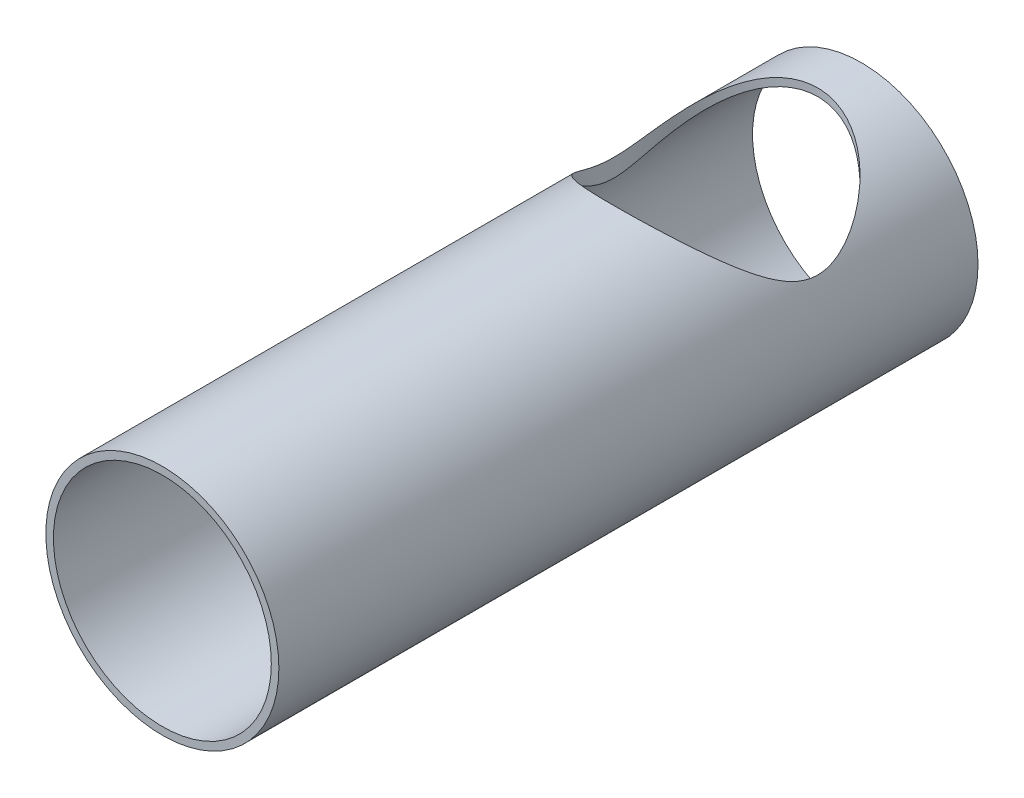
ISO-10303-21;
HEADER;
FILE_DESCRIPTION(('STEP AP214'),'2;1');
FILE_NAME('part.step','',(''),(''),'','','');
FILE_SCHEMA(('AUTOMOTIVE_DESIGN { 1 0 10303 214 1 1 1 1 }'));
ENDSEC;
DATA;
#1=APPLICATION_CONTEXT('core data for automotive mechanical design processes');
#2=APPLICATION_PROTOCOL_DEFINITION('international standard','automotive_design',2000,#1);
#3=PRODUCT_CONTEXT('',#1,'mechanical');
#4=PRODUCT('Part','Part','',(#3));
#5=PRODUCT_RELATED_PRODUCT_CATEGORY('part','',(#4));
#6=PRODUCT_DEFINITION_FORMATION('','',#4);
#7=PRODUCT_DEFINITION_CONTEXT('part definition',#1,'design');
#8=PRODUCT_DEFINITION('design','',#6,#7);
#9=PRODUCT_DEFINITION_SHAPE('','',#8);
#10=(LENGTH_UNIT() NAMED_UNIT(*) SI_UNIT(.MILLI.,.METRE.));
#11=(NAMED_UNIT(*) PLANE_ANGLE_UNIT() SI_UNIT($,.RADIAN.));
#12=(NAMED_UNIT(*) SI_UNIT($,.STERADIAN.) SOLID_ANGLE_UNIT());
#13=UNCERTAINTY_MEASURE_WITH_UNIT(LENGTH_MEASURE(1.E-05),#10,'distance_accuracy_value','');
#14=(GEOMETRIC_REPRESENTATION_CONTEXT(3) GLOBAL_UNCERTAINTY_ASSIGNED_CONTEXT((#13)) GLOBAL_UNIT_ASSIGNED_CONTEXT((#10,
#11,#12)) REPRESENTATION_CONTEXT('',''));
#15=CARTESIAN_POINT('',(0.,0.,0.));
#16=DIRECTION('',(0.,0.,1.));
#17=DIRECTION('',(1.,0.,0.));
#18=AXIS2_PLACEMENT_3D('',#15,#16,#17);
#19=CARTESIAN_POINT('',(0.,0.,152.4));
#20=DIRECTION('',(0.,0.,1.));
#21=DIRECTION('',(1.,0.,0.));
#22=AXIS2_PLACEMENT_3D('',#19,#20,#21);
#23=PLANE('',#22);
#24=CARTESIAN_POINT('',(0.,0.,152.4));
#25=DIRECTION('',(0.,0.,1.));
#26=DIRECTION('',(1.,0.,0.));
#27=AXIS2_PLACEMENT_3D('',#24,#25,#26);
#28=CIRCLE('',#27,25.4);
#29=CARTESIAN_POINT('',(25.4,0.,152.4));
#30=VERTEX_POINT('',#29);
#31=EDGE_CURVE('E10',#30,#30,#28,.T.);
#32=ORIENTED_EDGE('',*,*,#31,.T.);
#33=EDGE_LOOP('',(#32));
#34=FACE_BOUND('',#33,.T.);
#35=CARTESIAN_POINT('',(0.,0.,152.4));
#36=DIRECTION('',(0.,0.,1.));
#37=DIRECTION('',(1.,0.,0.));
#38=AXIS2_PLACEMENT_3D('',#35,#36,#37);
#39=CIRCLE('',#38,23.749);
#40=CARTESIAN_POINT('',(23.749,0.,152.4));
#41=VERTEX_POINT('',#40);
#42=EDGE_CURVE('E48',#41,#41,#39,.T.);
#43=ORIENTED_EDGE('',*,*,#42,.F.);
#44=EDGE_LOOP('',(#43));
#45=FACE_BOUND('',#44,.T.);
#46=ADVANCED_FACE('F30',(#34,#45),#23,.T.);
#47=CARTESIAN_POINT('',(0.,0.,0.));
#48=DIRECTION('',(0.,0.,1.));
#49=DIRECTION('',(1.,0.,0.));
#50=AXIS2_PLACEMENT_3D('',#47,#48,#49);
#51=PLANE('',#50);
#52=CARTESIAN_POINT('',(0.,0.,0.));
#53=DIRECTION('',(0.,0.,1.));
#54=DIRECTION('',(1.,0.,0.));
#55=AXIS2_PLACEMENT_3D('',#52,#53,#54);
#56=CIRCLE('',#55,25.4);
#57=CARTESIAN_POINT('',(25.4,0.,0.));
#58=VERTEX_POINT('',#57);
#59=EDGE_CURVE('E43',#58,#58,#56,.T.);
#60=ORIENTED_EDGE('',*,*,#59,.F.);
#61=EDGE_LOOP('',(#60));
#62=FACE_BOUND('',#61,.T.);
#63=CARTESIAN_POINT('',(0.,0.,0.));
#64=DIRECTION('',(0.,0.,1.));
#65=DIRECTION('',(1.,0.,0.));
#66=AXIS2_PLACEMENT_3D('',#63,#64,#65);
#67=CIRCLE('',#66,23.749);
#68=CARTESIAN_POINT('',(23.749,0.,0.));
#69=VERTEX_POINT('',#68);
#70=EDGE_CURVE('E50',#69,#69,#67,.T.);
#71=ORIENTED_EDGE('',*,*,#70,.T.);
#72=EDGE_LOOP('',(#71));
#73=FACE_BOUND('',#72,.T.);
#74=ADVANCED_FACE('F70',(#62,#73),#51,.F.);
#75=CARTESIAN_POINT('',(0.,0.,152.4));
#76=DIRECTION('',(0.,0.,-1.));
#77=DIRECTION('',(-1.,0.,0.));
#78=AXIS2_PLACEMENT_3D('',#75,#76,#77);
#79=CYLINDRICAL_SURFACE('',#78,25.4);
#80=CARTESIAN_POINT('',(0.,25.4,53.975));
#81=CARTESIAN_POINT('',(-0.519823802327773,25.4000054836974,53.9750055511225));
#82=CARTESIAN_POINT('',(-1.03958620519413,25.3840145171001,53.9567359516643));
#83=CARTESIAN_POINT('',(-2.07481628491507,25.3204280604762,53.8840240452894));
#84=CARTESIAN_POINT('',(-2.59028247446275,25.2728220511353,53.8295696985709));
#85=CARTESIAN_POINT('',(-3.61309308209678,25.146996793013,53.6854349278926));
#86=CARTESIAN_POINT('',(-4.12042669317329,25.0687398405884,53.5957111185667));
#87=CARTESIAN_POINT('',(-5.12252540902101,24.8833155368873,53.382678185024));
#88=CARTESIAN_POINT('',(-5.61729126079152,24.7761499082978,53.2593710620544));
#89=CARTESIAN_POINT('',(-6.58793148033367,24.5358420200911,52.9821198827729));
#90=CARTESIAN_POINT('',(-7.06390837590426,24.4028745387744,52.8283818282472));
#91=CARTESIAN_POINT('',(-7.99792507023292,24.1129081843878,52.4919920730117));
#92=CARTESIAN_POINT('',(-8.45596499162574,23.955909475655,52.3093405700258));
#93=CARTESIAN_POINT('',(-9.35227556590302,23.6204141358293,51.9174205121539));
#94=CARTESIAN_POINT('',(-9.79054664500769,23.4419179685306,51.7081525314966));
#95=CARTESIAN_POINT('',(-10.6461849736762,23.065930839581,51.2651612483445));
#96=CARTESIAN_POINT('',(-11.063547584585,22.8684356910371,51.0314325543279));
#97=CARTESIAN_POINT('',(-11.7519653266435,22.5200186286792,50.6166466494923));
#98=CARTESIAN_POINT('',(-12.0286972709273,22.3733468856828,50.4413682409221));
#99=CARTESIAN_POINT('',(-12.5714382849217,22.0729502675448,50.0807309788536));
#100=CARTESIAN_POINT('',(-12.8374495890627,21.9192268765618,49.8953742450298));
#101=CARTESIAN_POINT('',(-13.6195402076249,21.4485053834397,49.32484960735));
#102=CARTESIAN_POINT('',(-14.1195596680896,21.1220155649182,48.9252979224533));
#103=CARTESIAN_POINT('',(-15.0773330642576,20.4493863511186,48.0910258299805));
#104=CARTESIAN_POINT('',(-15.5349863098537,20.1032031493937,47.6562260242676));
#105=CARTESIAN_POINT('',(-16.4070608410884,19.3980072606517,46.7550684134812));
#106=CARTESIAN_POINT('',(-16.821487891552,19.0389962929946,46.2887148302627));
#107=CARTESIAN_POINT('',(-17.6160794557904,18.3066069863575,45.3156734346481));
#108=CARTESIAN_POINT('',(-17.9953107570615,17.933085807649,44.8083320674139));
#109=CARTESIAN_POINT('',(-18.7095249791243,17.1866384743985,43.7627176452855));
#110=CARTESIAN_POINT('',(-19.0444939672162,16.8137125435461,43.2244349269566));
#111=CARTESIAN_POINT('',(-19.6692309595251,16.0783458441971,42.1170394555691));
#112=CARTESIAN_POINT('',(-19.9590860308547,15.7158860067669,41.5479890171378));
#113=CARTESIAN_POINT('',(-20.3593819356573,15.1889577137914,40.6690567002232));
#114=CARTESIAN_POINT('',(-20.487042733145,15.016143351596,40.3719187613854));
#115=CARTESIAN_POINT('',(-20.7305888840666,14.6780790477691,39.7686744930455));
#116=CARTESIAN_POINT('',(-20.8464761799542,14.5128278608057,39.4625696537209));
#117=CARTESIAN_POINT('',(-21.0693312287098,14.1874356130278,38.8316077885116));
#118=CARTESIAN_POINT('',(-21.1759285810531,14.0275951774814,38.5064637301777));
#119=CARTESIAN_POINT('',(-21.3755249146236,13.7215274292618,37.84562969509));
#120=CARTESIAN_POINT('',(-21.468521701471,13.5753023147288,37.5099380271261));
#121=CARTESIAN_POINT('',(-21.6398867365042,13.3004325025477,36.8283100893339));
#122=CARTESIAN_POINT('',(-21.7182757602428,13.1717629078635,36.482389192344));
#123=CARTESIAN_POINT('',(-21.8594565280216,12.9361142288936,35.7802444725621));
#124=CARTESIAN_POINT('',(-21.9222574554377,12.8291223805111,35.4240268546233));
#125=CARTESIAN_POINT('',(-22.0226947908708,12.6558034471652,34.7578018102627));
#126=CARTESIAN_POINT('',(-22.0627173618689,12.5857511241718,34.4491284047908));
#127=CARTESIAN_POINT('',(-22.1300170719893,12.4670376083329,33.8263007142773));
#128=CARTESIAN_POINT('',(-22.1572957383813,12.4183738522557,33.5121470906857));
#129=CARTESIAN_POINT('',(-22.1984758888103,12.3446131101086,32.880606545073));
#130=CARTESIAN_POINT('',(-22.2123952355627,12.3194846561296,32.5632245155616));
#131=CARTESIAN_POINT('',(-22.2265703413379,12.2938925727512,31.9271483714769));
#132=CARTESIAN_POINT('',(-22.226826154231,12.2934288461075,31.6084542620817));
#133=CARTESIAN_POINT('',(-22.2136673954591,12.3171894529157,30.9722889404162));
#134=CARTESIAN_POINT('',(-22.2002529725066,12.3414135177997,30.6548177148804));
#135=CARTESIAN_POINT('',(-22.1600925422608,12.4133788644476,30.023437113571));
#136=CARTESIAN_POINT('',(-22.1333461606459,12.4611208065227,29.7095278380593));
#137=CARTESIAN_POINT('',(-22.0670674447329,12.5781171417031,29.0866505845814));
#138=CARTESIAN_POINT('',(-22.027515142212,12.6474051247476,28.7776911196409));
#139=CARTESIAN_POINT('',(-21.9363615052554,12.8048550922634,28.1663916925407));
#140=CARTESIAN_POINT('',(-21.8847558716845,12.8930238101065,27.8640541344404));
#141=CARTESIAN_POINT('',(-21.7357246391208,13.1434535792102,27.0866902988676));
#142=CARTESIAN_POINT('',(-21.6294295028535,13.3183419529357,26.617414257144));
#143=CARTESIAN_POINT('',(-21.3905218534281,13.6987597677856,25.6983877049957));
#144=CARTESIAN_POINT('',(-21.2578916398428,13.9043097940906,25.2486505762796));
#145=CARTESIAN_POINT('',(-20.9678481366797,14.3379794424217,24.3664870676718));
#146=CARTESIAN_POINT('',(-20.8103498548616,14.566175430374,23.9341266785143));
#147=CARTESIAN_POINT('',(-20.4722722324348,15.0376269206162,23.0871715035257));
#148=CARTESIAN_POINT('',(-20.2916953331763,15.2808808286165,22.6725748447601));
#149=CARTESIAN_POINT('',(-19.9458670414013,15.7285098770255,21.9396283784508));
#150=CARTESIAN_POINT('',(-19.7845525953432,15.9311566420138,21.6183457599921));
#151=CARTESIAN_POINT('',(-19.4477441996339,16.3406094732699,20.9859755432699));
#152=CARTESIAN_POINT('',(-19.2722487897628,16.5474159662157,20.6748889995482));
#153=CARTESIAN_POINT('',(-18.9071406669594,16.9633915550764,20.0624942630911));
#154=CARTESIAN_POINT('',(-18.7175217755647,17.1725616506278,19.7611904336503));
#155=CARTESIAN_POINT('',(-18.3242727021239,17.5915788088537,19.1683402613312));
#156=CARTESIAN_POINT('',(-18.1206411919225,17.8014259338974,18.8767948472863));
#157=CARTESIAN_POINT('',(-17.4891719797949,18.4293447884603,18.0173791819659));
#158=CARTESIAN_POINT('',(-17.0402950209045,18.8463308455111,17.4639506516852));
#159=CARTESIAN_POINT('',(-16.0862473158433,19.6669420964942,16.3976503851337));
#160=CARTESIAN_POINT('',(-15.5811019148992,20.0705732005383,15.8847605653977));
#161=CARTESIAN_POINT('',(-14.6350986064804,20.766221909042,15.0144580417599));
#162=CARTESIAN_POINT('',(-14.2057007742668,21.0627667810511,14.6481918478394));
#163=CARTESIAN_POINT('',(-13.3128283447765,21.6381764769838,13.9443153300806));
#164=CARTESIAN_POINT('',(-12.8493545333973,21.9170417083787,13.606704345751));
#165=CARTESIAN_POINT('',(-11.8893002753956,22.4523053599947,12.9636130207897));
#166=CARTESIAN_POINT('',(-11.3927672101377,22.7087347651187,12.6580882468883));
#167=CARTESIAN_POINT('',(-10.6237817083163,23.0732698314186,12.2263650574255));
#168=CARTESIAN_POINT('',(-10.3634338493728,23.1914254002683,12.0868900412431));
#169=CARTESIAN_POINT('',(-9.83476864396406,23.4205110113687,11.8172122413826));
#170=CARTESIAN_POINT('',(-9.56644925649448,23.5314391795168,11.6870118618558));
#171=CARTESIAN_POINT('',(-8.85288105568058,23.8120003883797,11.3585022843664));
#172=CARTESIAN_POINT('',(-8.40136895319473,23.9752424777224,11.1681888811855));
#173=CARTESIAN_POINT('',(-7.48001301815785,24.2784797278211,10.8157394514365));
#174=CARTESIAN_POINT('',(-7.01017298698764,24.4184796778824,10.6535976194764));
#175=CARTESIAN_POINT('',(-6.05443615022602,24.6728228937818,10.3597163685929));
#176=CARTESIAN_POINT('',(-5.5685448474004,24.787174849771,10.2279666516648));
#177=CARTESIAN_POINT('',(-4.58343969473716,24.9880921998027,9.99687061200007));
#178=CARTESIAN_POINT('',(-4.08422569706043,25.0746572853612,9.89752464900293));
#179=CARTESIAN_POINT('',(-3.07323644523442,25.218590202307,9.73251703171864));
#180=CARTESIAN_POINT('',(-2.56140773905206,25.2757970934707,9.6670410356847));
#181=CARTESIAN_POINT('',(-1.53189769642862,25.3590214666072,9.57183210776126));
#182=CARTESIAN_POINT('',(-1.01421634685743,25.3850388785939,9.54209925607577));
#183=CARTESIAN_POINT('',(0.0224887480275072,25.4052798484067,9.51896537879347));
#184=CARTESIAN_POINT('',(0.541512239417398,25.3995090350417,9.52555792098177));
#185=CARTESIAN_POINT('',(1.57648415046524,25.3563191159774,9.57493091847082));
#186=CARTESIAN_POINT('',(2.09243273679967,25.3189017416984,9.61770939399698));
#187=CARTESIAN_POINT('',(3.07256582789458,25.2178646462917,9.73336915318886));
#188=CARTESIAN_POINT('',(3.53736518225783,25.1567933859462,9.80332417880071));
#189=CARTESIAN_POINT('',(4.4578064095538,25.0101003909245,9.97162886616789));
#190=CARTESIAN_POINT('',(4.91344892571504,24.924480387188,10.0699765259529));
#191=CARTESIAN_POINT('',(5.81307487119292,24.7301436398533,10.2936793167354));
#192=CARTESIAN_POINT('',(6.25705628969609,24.6214229418242,10.4190390717785));
#193=CARTESIAN_POINT('',(7.13115148198112,24.3826166127642,10.6951331945627));
#194=CARTESIAN_POINT('',(7.56126439658104,24.2525296610813,10.8458691308245));
#195=CARTESIAN_POINT('',(8.43406786427082,23.9635488284337,11.1818177425458));
#196=CARTESIAN_POINT('',(8.87568588779339,23.8033127967783,11.3686587453474));
#197=CARTESIAN_POINT('',(9.73964895978822,23.4630527131078,11.7671020259201));
#198=CARTESIAN_POINT('',(10.1619937037974,23.2830283486463,11.9787046946671));
#199=CARTESIAN_POINT('',(10.9863196284594,22.9055940946111,12.4246030769198));
#200=CARTESIAN_POINT('',(11.3883035984436,22.7081865966485,12.6588956691355));
#201=CARTESIAN_POINT('',(12.1713708463242,22.2982767180027,13.1483432210002));
#202=CARTESIAN_POINT('',(12.5524497772714,22.0857712187991,13.4035024923543));
#203=CARTESIAN_POINT('',(13.4839204678344,21.535282198649,14.0692192208327));
#204=CARTESIAN_POINT('',(14.0205862382889,21.1889767030252,14.49220407211));
#205=CARTESIAN_POINT('',(15.0448573595225,20.4744363678255,15.3774154842799));
#206=CARTESIAN_POINT('',(15.5324402483108,20.1061916097051,15.8396598348506));
#207=CARTESIAN_POINT('',(16.4610357128919,19.3533763448432,16.8022778947835));
#208=CARTESIAN_POINT('',(16.9018046910939,18.9687337706252,17.3028297540335));
#209=CARTESIAN_POINT('',(17.7343551547004,18.1927574691639,18.3379001351456));
#210=CARTESIAN_POINT('',(18.1261485477574,17.8014253947747,18.8724103527064));
#211=CARTESIAN_POINT('',(18.8697098470232,17.0115979089483,19.9880035029548));
#212=CARTESIAN_POINT('',(19.2203453062264,16.6131456166668,20.56987659091));
#213=CARTESIAN_POINT('',(19.707853448524,16.0257790305543,21.4705232254136));
#214=CARTESIAN_POINT('',(19.8640284166219,15.8315986927539,21.7755641140408));
#215=CARTESIAN_POINT('',(20.1632921144133,15.448644451123,22.3952840396385));
#216=CARTESIAN_POINT('',(20.306382720181,15.2598697748873,22.7099616861979));
#217=CARTESIAN_POINT('',(20.5782774916311,14.8911594199864,23.3473589143998));
#218=CARTESIAN_POINT('',(20.7071693572031,14.7111738101312,23.6700120632968));
#219=CARTESIAN_POINT('',(20.9512870203423,14.3613735887104,24.3259396831903));
#220=CARTESIAN_POINT('',(21.0665109697981,14.1915603541387,24.6592155828333));
#221=CARTESIAN_POINT('',(21.2824036914978,13.8656923113977,25.3362693414702));
#222=CARTESIAN_POINT('',(21.383098478376,13.709613112877,25.6800270609387));
#223=CARTESIAN_POINT('',(21.5692374698158,13.4148562202302,26.3788481404553));
#224=CARTESIAN_POINT('',(21.6546886989407,13.2761705195965,26.7339062037043));
#225=CARTESIAN_POINT('',(21.7985764781736,13.0383532143361,27.4056001932957));
#226=CARTESIAN_POINT('',(21.8591133975141,12.9364043962207,27.7207822468986));
#227=CARTESIAN_POINT('',(21.9671729740643,12.7520487094139,28.3590342719728));
#228=CARTESIAN_POINT('',(22.0146970719552,12.6696396775608,28.6821033659337));
#229=CARTESIAN_POINT('',(22.0957354139059,12.5277757805084,29.3340798084836));
#230=CARTESIAN_POINT('',(22.1292884010411,12.4682574729059,29.662968339354));
#231=CARTESIAN_POINT('',(22.1817925910656,12.3746107462583,30.3255360654361));
#232=CARTESIAN_POINT('',(22.2007443967178,12.3404812791183,30.6592150623094));
#233=CARTESIAN_POINT('',(22.2236121872714,12.2992537525632,31.3311335766691));
#234=CARTESIAN_POINT('',(22.2274218797813,12.2923467885176,31.669388666691));
#235=CARTESIAN_POINT('',(22.2196003131621,12.3064787562148,32.3451190394757));
#236=CARTESIAN_POINT('',(22.2079692371472,12.3275173565474,32.6825943314387));
#237=CARTESIAN_POINT('',(22.169564310634,12.3964490751047,33.3545333195779));
#238=CARTESIAN_POINT('',(22.1427615200113,12.4443935148524,33.6889900154071));
#239=CARTESIAN_POINT('',(22.0746829654222,12.564756874716,34.3519463646877));
#240=CARTESIAN_POINT('',(22.0334046264599,12.6371801491884,34.6804449473333));
#241=CARTESIAN_POINT('',(21.9212633102407,12.8309993829509,35.4378284202939));
#242=CARTESIAN_POINT('',(21.8451277050383,12.9606716478398,35.863811859819));
#243=CARTESIAN_POINT('',(21.6708059744932,13.2500802667497,36.7007353551573));
#244=CARTESIAN_POINT('',(21.5726100457615,13.4098299817648,37.111668628111));
#245=CARTESIAN_POINT('',(21.3556622145253,13.7527074744337,37.919417281039));
#246=CARTESIAN_POINT('',(21.236851491898,13.9359017427479,38.3161882354104));
#247=CARTESIAN_POINT('',(20.9802321692766,14.3193251570087,39.0949708516807));
#248=CARTESIAN_POINT('',(20.8424238620113,14.5195540404553,39.476982740882));
#249=CARTESIAN_POINT('',(20.5687101120092,14.9042314146815,40.1761435425895));
#250=CARTESIAN_POINT('',(20.4350900965663,15.0871276984885,40.4950532656678));
#251=CARTESIAN_POINT('',(20.1547519084235,15.4596352400552,41.1230930527859));
#252=CARTESIAN_POINT('',(20.008031899988,15.64924743668,41.4322217379374));
#253=CARTESIAN_POINT('',(19.7017031583833,16.0331915730583,42.0412467044476));
#254=CARTESIAN_POINT('',(19.5420883859264,16.2275256941912,42.3411385678354));
#255=CARTESIAN_POINT('',(19.210179036615,16.6191144632221,42.9318784396256));
#256=CARTESIAN_POINT('',(19.0378830946005,16.8163694237245,43.2227254695204));
#257=CARTESIAN_POINT('',(18.5016454704908,17.4107376120207,44.0827592844362));
#258=CARTESIAN_POINT('',(18.1186944903648,17.8100209072804,44.6387636958117));
#259=CARTESIAN_POINT('',(17.302376686167,18.6040933423392,45.7154765060318));
#260=CARTESIAN_POINT('',(16.8690222242491,18.9988835581593,46.2361935102253));
#261=CARTESIAN_POINT('',(15.9348360614195,19.7896113978913,47.2589722111484));
#262=CARTESIAN_POINT('',(15.4321473789327,20.1850865689315,47.7597037296937));
#263=CARTESIAN_POINT('',(14.3713269603551,20.9536168306865,48.7184013895353));
#264=CARTESIAN_POINT('',(13.8131819721401,21.3266665281462,49.1763572579733));
#265=CARTESIAN_POINT('',(12.6434732851326,22.0402032751854,50.0426558523998));
#266=CARTESIAN_POINT('',(12.0320781234194,22.3807863932349,50.4511459825912));
#267=CARTESIAN_POINT('',(10.7560900331691,23.0211892596221,51.2129980960136));
#268=CARTESIAN_POINT('',(10.0915363862582,23.3210386741245,51.5664002275373));
#269=CARTESIAN_POINT('',(8.96401799082329,23.7703452496608,52.0928422768333));
#270=CARTESIAN_POINT('',(8.5157126658477,23.9348194505449,52.2847131918456));
#271=CARTESIAN_POINT('',(7.60062634424835,24.2409381143301,52.6407151939291));
#272=CARTESIAN_POINT('',(7.13384755514558,24.3825852947901,52.8048495831493));
#273=CARTESIAN_POINT('',(6.18480133609995,24.6404051542772,53.1028866520317));
#274=CARTESIAN_POINT('',(5.70256257067679,24.7566221693258,53.2368419594443));
#275=CARTESIAN_POINT('',(4.724771844547,24.9616913277358,53.4728004481738));
#276=CARTESIAN_POINT('',(4.22922377209708,25.050551370775,53.5748128535604));
#277=CARTESIAN_POINT('',(3.11748407418648,25.2155228967604,53.7639921115682));
#278=CARTESIAN_POINT('',(2.49879010028019,25.2844998037467,53.8429220556398));
#279=CARTESIAN_POINT('',(1.2533690021147,25.3767408251873,53.9484292678772));
#280=CARTESIAN_POINT('',(0.626639888377164,25.399993389484,53.9749933082041));
#281=CARTESIAN_POINT('',(0.,25.4,53.975));
#282=B_SPLINE_CURVE_WITH_KNOTS('',3,(#80,#81,#82,#83,#84,#85,#86,#87,#88,#89,#90,#91,#92,#93,
#94,#95,#96,#97,#98,#99,#100,#101,#102,#103,#104,#105,#106,#107,#108,#109,#110,#111,#112,#113,
#114,#115,#116,#117,#118,#119,#120,#121,#122,#123,#124,#125,#126,#127,#128,#129,#130,#131,#132,
#133,#134,#135,#136,#137,#138,#139,#140,#141,#142,#143,#144,#145,#146,#147,#148,#149,#150,#151,
#152,#153,#154,#155,#156,#157,#158,#159,#160,#161,#162,#163,#164,#165,#166,#167,#168,#169,#170,
#171,#172,#173,#174,#175,#176,#177,#178,#179,#180,#181,#182,#183,#184,#185,#186,#187,#188,#189,
#190,#191,#192,#193,#194,#195,#196,#197,#198,#199,#200,#201,#202,#203,#204,#205,#206,#207,#208,
#209,#210,#211,#212,#213,#214,#215,#216,#217,#218,#219,#220,#221,#222,#223,#224,#225,#226,#227,
#228,#229,#230,#231,#232,#233,#234,#235,#236,#237,#238,#239,#240,#241,#242,#243,#244,#245,#246,
#247,#248,#249,#250,#251,#252,#253,#254,#255,#256,#257,#258,#259,#260,#261,#262,#263,#264,#265,
#266,#267,#268,#269,#270,#271,#272,#273,#274,#275,#276,#277,#278,#279,#280,#281),.UNSPECIFIED.,
.T.,.F.,(4,2,2,2,2,2,2,2,2,2,2,2,2,2,2,2,2,2,2,2,2,2,2,2,2,2,2,2,2,2,2,2,2,2,2,2,2,2,2,2,2,2,2,
2,2,2,2,2,2,2,2,2,2,2,2,2,2,2,2,2,2,2,2,2,2,2,2,2,2,2,2,2,2,2,2,2,2,2,2,2,2,2,2,2,2,2,2,2,2,2,2,
2,2,2,2,2,2,2,2,2,4),(0.,1.55880480717345,3.11812853754382,4.67937644262668,6.24053133247547,
7.79145873668107,9.34237553537328,10.8932588799894,12.4444847862724,13.5208492758895,
14.5969882535475,16.7497109115871,18.9074251236398,21.0648512050285,23.268868864978,
25.4735786517501,27.6739792631881,28.7737138681579,29.8732667375123,31.0057032987154,
32.1383223715039,33.2693180995193,34.3996459369451,35.3558617632883,36.3119629643045,
37.2667839762335,38.2216012236446,39.1764080841234,40.1312417542341,41.0875715216922,
42.0442429114286,43.5775322178987,45.1118555941763,46.6515411393649,48.19106394494,
49.4287374948399,50.6665386513188,51.9048845134311,53.1433479115356,55.6171227181157,
58.0897877238353,60.0008028852229,61.9117739864985,63.8200628595637,64.7741258749898,
65.7284353073349,67.276193374374,68.8236321114516,70.370545744723,71.9174765509114,
73.4727993261011,75.028125591272,76.5831764603593,78.1381422563031,79.558508739671,
80.9787750971637,82.3992847753339,83.8198822885312,85.335168082185,86.8504778047708,
88.3655793723666,89.8809948019773,92.1758325454598,94.4717157552873,96.7790139429778,
99.0857500513093,101.445723872762,102.627088103546,103.808282680391,104.981715431177,
106.155306667593,107.326769781675,108.497691657611,109.507136407213,110.516469353503,
111.522984387136,112.529457867796,113.542984096142,114.556498305049,115.57195234413,
116.587587109871,117.940596068976,119.294207485393,120.651746652344,122.009264903668,
123.182339532617,124.355578806299,125.529370790416,126.703289321558,129.053733326526,
131.403602063285,133.837383632036,136.27174819495,138.698670045388,141.123814794077,
142.666317872512,144.208637179947,145.748245731166,147.287409282704,149.166050879962,
151.045166968904),.UNSPECIFIED.);
#283=CARTESIAN_POINT('',(0.,25.4,53.975));
#284=VERTEX_POINT('',#283);
#285=EDGE_CURVE('E53',#284,#284,#282,.T.);
#286=ORIENTED_EDGE('',*,*,#285,.T.);
#287=EDGE_LOOP('',(#286));
#288=FACE_BOUND('',#287,.T.);
#289=ORIENTED_EDGE('',*,*,#31,.F.);
#290=EDGE_LOOP('',(#289));
#291=FACE_BOUND('',#290,.T.);
#292=ORIENTED_EDGE('',*,*,#59,.T.);
#293=EDGE_LOOP('',(#292));
#294=FACE_BOUND('',#293,.T.);
#295=ADVANCED_FACE('F32',(#288,#291,#294),#79,.T.);
#296=CARTESIAN_POINT('',(0.,0.,152.4));
#297=DIRECTION('',(0.,0.,-1.));
#298=DIRECTION('',(-1.,0.,0.));
#299=AXIS2_PLACEMENT_3D('',#296,#297,#298);
#300=CYLINDRICAL_SURFACE('',#299,23.749);
#301=CARTESIAN_POINT('',(0.,23.749,53.975));
#302=CARTESIAN_POINT('',(-0.508421397562057,23.7490009599088,53.9750009696588));
#303=CARTESIAN_POINT('',(-1.01683112982311,23.7326426586314,53.9575235527592));
#304=CARTESIAN_POINT('',(-2.02917171744393,23.6675880439161,53.8879876818032));
#305=CARTESIAN_POINT('',(-2.53310267779236,23.6188924905455,53.8359300405337));
#306=CARTESIAN_POINT('',(-3.53246007076361,23.4902250197733,53.6982776689303));
#307=CARTESIAN_POINT('',(-4.02788347610394,23.4102422005318,53.6126712487282));
#308=CARTESIAN_POINT('',(-5.00634161876204,23.2206786668325,53.4095676290945));
#309=CARTESIAN_POINT('',(-5.48937600285343,23.1110971095029,53.2920695214952));
#310=CARTESIAN_POINT('',(-6.43693579467895,22.8652348449971,53.028084566229));
#311=CARTESIAN_POINT('',(-6.90155896098086,22.7291274241431,52.8817858058289));
#312=CARTESIAN_POINT('',(-7.81310945678628,22.4321229721138,52.5619983981921));
#313=CARTESIAN_POINT('',(-8.2600372799249,22.2712266330717,52.3885105101027));
#314=CARTESIAN_POINT('',(-9.13447239422934,21.9270882352124,52.0166668296427));
#315=CARTESIAN_POINT('',(-9.56197954268282,21.7438460122235,51.8183108545698));
#316=CARTESIAN_POINT('',(-10.3964487451608,21.3574433458018,51.3989856335029));
#317=CARTESIAN_POINT('',(-10.8034060667308,21.1542783457246,51.1780112138153));
#318=CARTESIAN_POINT('',(-11.7564806504575,20.6445798905165,50.6219688830116));
#319=CARTESIAN_POINT('',(-12.2922442667244,20.3294942239933,50.2769255777429));
#320=CARTESIAN_POINT('',(-13.3208439693916,19.6708772144328,49.5517436962813));
#321=CARTESIAN_POINT('',(-13.8136642203971,19.32733546852,49.1715922794959));
#322=CARTESIAN_POINT('',(-14.7577526686019,18.6164933240871,48.3794963990322));
#323=CARTESIAN_POINT('',(-15.2088947194907,18.2491261797981,47.9674619335433));
#324=CARTESIAN_POINT('',(-16.0685479889616,17.4969446757685,47.1161426361953));
#325=CARTESIAN_POINT('',(-16.4770634760812,17.1121320685276,46.6768605398963));
#326=CARTESIAN_POINT('',(-17.3555757463082,16.2260402471634,45.6533351339137));
#327=CARTESIAN_POINT('',(-17.8130785685544,15.7209764952928,45.061581594922));
#328=CARTESIAN_POINT('',(-18.4507356448523,14.9564629303549,44.1459391666807));
#329=CARTESIAN_POINT('',(-18.6552756638592,14.7003464878969,43.8358995357176));
#330=CARTESIAN_POINT('',(-19.0483300739631,14.1873345954942,43.2064158637131));
#331=CARTESIAN_POINT('',(-19.2368450394665,13.9304391738137,42.8869721603071));
#332=CARTESIAN_POINT('',(-19.5975146474504,13.4182813139176,42.2392852256901));
#333=CARTESIAN_POINT('',(-19.7697095254539,13.1630163875252,41.9110663362065));
#334=CARTESIAN_POINT('',(-20.0983556443377,12.6555308918133,41.2444641736664));
#335=CARTESIAN_POINT('',(-20.2548052217667,12.4033106466288,40.9060798315489));
#336=CARTESIAN_POINT('',(-20.5516957004185,11.9049078531342,40.2186749929725));
#337=CARTESIAN_POINT('',(-20.6921548007373,11.6587186964209,39.8696671727036));
#338=CARTESIAN_POINT('',(-20.9569846574099,11.1756673612518,39.1593921179434));
#339=CARTESIAN_POINT('',(-21.0813602527558,10.9388023924463,38.7981286122672));
#340=CARTESIAN_POINT('',(-21.2788515676665,10.5478981108278,38.1714037540237));
#341=CARTESIAN_POINT('',(-21.3561868132897,10.3902390163103,37.9095317292909));
#342=CARTESIAN_POINT('',(-21.5023655897863,10.0842448604274,37.3780458822505));
#343=CARTESIAN_POINT('',(-21.5712091432945,9.93590977420898,37.1084320805814));
#344=CARTESIAN_POINT('',(-21.6998927737967,9.65163072737042,36.5608470993718));
#345=CARTESIAN_POINT('',(-21.7597400134119,9.51567694345453,36.2828827821407));
#346=CARTESIAN_POINT('',(-21.8698273610423,9.25986179235097,35.7179025158998));
#347=CARTESIAN_POINT('',(-21.9200692427993,9.13999745527868,35.4308882494946));
#348=CARTESIAN_POINT('',(-22.0367632298913,8.85616410681923,34.6743607094907));
#349=CARTESIAN_POINT('',(-22.0952540298541,8.70797977786708,34.1972137879402));
#350=CARTESIAN_POINT('',(-22.1598841284349,8.54155026609918,33.4674999743156));
#351=CARTESIAN_POINT('',(-22.1775701310035,8.4954004272201,33.2221888763712));
#352=CARTESIAN_POINT('',(-22.2048458284003,8.42385362458984,32.7280465459209));
#353=CARTESIAN_POINT('',(-22.2144362096501,8.39845490137329,32.4792156136785));
#354=CARTESIAN_POINT('',(-22.2252519612188,8.36979245746544,31.9781865812269));
#355=CARTESIAN_POINT('',(-22.2264132083739,8.36669841696391,31.725977262779));
#356=CARTESIAN_POINT('',(-22.2201641548552,8.3832796335976,31.2224244280959));
#357=CARTESIAN_POINT('',(-22.2127537278185,8.40295522640061,30.9710809246793));
#358=CARTESIAN_POINT('',(-22.1895823149644,8.4639519550761,30.4709943343765));
#359=CARTESIAN_POINT('',(-22.1738058921479,8.50531310370303,30.2222569243499));
#360=CARTESIAN_POINT('',(-22.1343409216788,8.60749292054652,29.729415867059));
#361=CARTESIAN_POINT('',(-22.1106489265302,8.66832006636767,29.4853142878959));
#362=CARTESIAN_POINT('',(-22.0442916951227,8.83602771375851,28.9005590566968));
#363=CARTESIAN_POINT('',(-21.9978406004216,8.95150184400489,28.5628054775842));
#364=CARTESIAN_POINT('',(-21.891504242242,9.20849301594854,27.8995877191463));
#365=CARTESIAN_POINT('',(-21.8316108103525,9.35002588314173,27.5741311533478));
#366=CARTESIAN_POINT('',(-21.6993667577681,9.65297378405837,26.9338449755429));
#367=CARTESIAN_POINT('',(-21.6269714775123,9.81445948447933,26.6190584756456));
#368=CARTESIAN_POINT('',(-21.4707522286674,10.151667214213,26.0002838535327));
#369=CARTESIAN_POINT('',(-21.3869297650543,10.3273873675936,25.6962943159767));
#370=CARTESIAN_POINT('',(-21.2007036603832,10.7048209511052,25.0719850953593));
#371=CARTESIAN_POINT('',(-21.0973200431908,10.9074681416399,24.7525263584327));
#372=CARTESIAN_POINT('',(-20.8781674853761,11.3213071471089,24.1234883170962));
#373=CARTESIAN_POINT('',(-20.7623957855522,11.5325008590723,23.8139112336481));
#374=CARTESIAN_POINT('',(-20.518647433879,11.9608061617011,23.2034321008218));
#375=CARTESIAN_POINT('',(-20.3906617995811,12.1779220225522,22.9025366512565));
#376=CARTESIAN_POINT('',(-20.1226608230331,12.6158411871817,22.3088551435009));
#377=CARTESIAN_POINT('',(-19.982644143295,12.8366448987335,22.0160699917269));
#378=CARTESIAN_POINT('',(-19.6904092211419,13.2805685989172,21.4377000151514));
#379=CARTESIAN_POINT('',(-19.5381742551289,13.5036913854511,21.1521257875332));
#380=CARTESIAN_POINT('',(-19.2216258057979,13.9505961348692,20.5882694542289));
#381=CARTESIAN_POINT('',(-19.0573114510227,14.1743781441924,20.3099878766332));
#382=CARTESIAN_POINT('',(-18.5462719461816,14.8447386439484,19.4860543563166));
#383=CARTESIAN_POINT('',(-18.1812838372517,15.2905876171743,18.9509842219336));
#384=CARTESIAN_POINT('',(-17.365153613043,16.2136003003562,17.8608731598841));
#385=CARTESIAN_POINT('',(-16.9091471015179,16.68979475591,17.3086418477941));
#386=CARTESIAN_POINT('',(-15.9358890397545,17.6214804347268,16.2412980361084));
#387=CARTESIAN_POINT('',(-15.4186174577632,18.0769648187056,15.7261977662447));
#388=CARTESIAN_POINT('',(-14.3230847377486,18.9566842266197,14.7399762537816));
#389=CARTESIAN_POINT('',(-13.7450269830889,19.381015869622,14.2687177072352));
#390=CARTESIAN_POINT('',(-12.8313839382475,19.9876014777142,13.5992794782441));
#391=CARTESIAN_POINT('',(-12.5191565942532,20.1847680586892,13.3824220979787));
#392=CARTESIAN_POINT('',(-11.8790731400167,20.5679789631686,12.9621087778768));
#393=CARTESIAN_POINT('',(-11.5512139302632,20.7540210642706,12.7586555150381));
#394=CARTESIAN_POINT('',(-10.8004880593062,21.1562351183954,12.3198346822186));
#395=CARTESIAN_POINT('',(-10.3735413616981,21.3690776806384,12.0883538235636));
#396=CARTESIAN_POINT('',(-9.49715080029563,21.7727303139187,11.6503824510278));
#397=CARTESIAN_POINT('',(-9.04771394995811,21.9635471929438,11.4438842142349));
#398=CARTESIAN_POINT('',(-8.12777566841076,22.3203388217075,11.0584932148255));
#399=CARTESIAN_POINT('',(-7.65728180943599,22.4863224098742,10.8795906299216));
#400=CARTESIAN_POINT('',(-6.69715620278406,22.7907149639603,10.5519816676832));
#401=CARTESIAN_POINT('',(-6.20752383130241,22.9291230301795,10.4032762755822));
#402=CARTESIAN_POINT('',(-5.2078497459426,23.1767254844483,10.1375365412341));
#403=CARTESIAN_POINT('',(-4.69767230522652,23.2856677098785,10.0207754800322));
#404=CARTESIAN_POINT('',(-3.66451408228374,23.4704425092316,9.82288089362298));
#405=CARTESIAN_POINT('',(-3.14153333023256,23.5462751611809,9.74174728445545));
#406=CARTESIAN_POINT('',(-2.08754752552854,23.6630111870961,9.61689780302517));
#407=CARTESIAN_POINT('',(-1.55654724493731,23.7039345604484,9.57316050653059));
#408=CARTESIAN_POINT('',(-0.491251297972977,23.7499011659618,9.52403528981059));
#409=CARTESIAN_POINT('',(0.0430439879409991,23.7549484657112,9.51864302206959));
#410=CARTESIAN_POINT('',(1.04541493542934,23.730621482515,9.54463959527048));
#411=CARTESIAN_POINT('',(1.51371339464095,23.7053209507573,9.57167542336723));
#412=CARTESIAN_POINT('',(2.44536439588641,23.6273919131543,9.65498945200927));
#413=CARTESIAN_POINT('',(2.9087174058965,23.5747660168665,9.71126486019058));
#414=CARTESIAN_POINT('',(3.82731709456949,23.4431650656669,9.85209508564503));
#415=CARTESIAN_POINT('',(4.28256312632094,23.3641879178443,9.93665214914978));
#416=CARTESIAN_POINT('',(5.18209944675413,23.1812755171766,10.1326828504066));
#417=CARTESIAN_POINT('',(5.62638923493489,23.0773391264686,10.2441577153113));
#418=CARTESIAN_POINT('',(6.50350466321271,22.8457017360202,10.4929123325302));
#419=CARTESIAN_POINT('',(6.93627255549089,22.7179001157148,10.6303013698428));
#420=CARTESIAN_POINT('',(7.78641246437141,22.4407374833582,10.9287276613721));
#421=CARTESIAN_POINT('',(8.20378492609728,22.2913770952437,11.0897642312031));
#422=CARTESIAN_POINT('',(9.02173794003492,21.9730710091782,11.4336099683573));
#423=CARTESIAN_POINT('',(9.42231781466283,21.8041245219583,11.6164200131031));
#424=CARTESIAN_POINT('',(10.2057155798288,21.4486246288371,12.0019701259725));
#425=CARTESIAN_POINT('',(10.5885296840347,21.2620674951359,12.2047144141314));
#426=CARTESIAN_POINT('',(11.5181578521825,20.7783482574937,12.7318213525819));
#427=CARTESIAN_POINT('',(12.0538009332522,20.4716513762264,13.0672375721848));
#428=CARTESIAN_POINT('',(13.0832411051202,19.8295784040913,13.7730895185406));
#429=CARTESIAN_POINT('',(13.5770210759165,19.4941906916192,14.1435394426348));
#430=CARTESIAN_POINT('',(14.5240321547643,18.7992919649098,14.9161743987947));
#431=CARTESIAN_POINT('',(14.9771355430367,18.4397107721926,15.3184524061586));
#432=CARTESIAN_POINT('',(15.8415660264666,17.7026139670965,16.1501546555848));
#433=CARTESIAN_POINT('',(16.2528970034984,17.3251000259867,16.5795763691776));
#434=CARTESIAN_POINT('',(17.1450694759183,16.4485513364736,17.5877430976859));
#435=CARTESIAN_POINT('',(17.6128108993986,15.9452642757006,18.1744528928651));
#436=CARTESIAN_POINT('',(18.2655144240456,15.1821709691132,19.0826955395145));
#437=CARTESIAN_POINT('',(18.4750165170296,14.9263256887151,19.3902884177727));
#438=CARTESIAN_POINT('',(18.8779123896099,14.4133864111578,20.0148739173855));
#439=CARTESIAN_POINT('',(19.0713067218701,14.1562924571618,20.3318662157356));
#440=CARTESIAN_POINT('',(19.4416727821973,13.6431754207401,20.9746007062994));
#441=CARTESIAN_POINT('',(19.6186835982803,13.3871512580503,21.3003195495482));
#442=CARTESIAN_POINT('',(19.9569207508731,12.8774931217542,21.9617447749691));
#443=CARTESIAN_POINT('',(20.1181456228942,12.6238593718794,22.2974520800278));
#444=CARTESIAN_POINT('',(20.4246013434911,12.1217598877023,22.97926148393));
#445=CARTESIAN_POINT('',(20.5698485991818,11.8732890684921,23.3253524461247));
#446=CARTESIAN_POINT('',(20.8443186642977,11.3845430330037,24.0293928355882));
#447=CARTESIAN_POINT('',(20.9735457351849,11.1442656496058,24.3873390770424));
#448=CARTESIAN_POINT('',(21.1805043149522,10.744129266113,25.0112070487341));
#449=CARTESIAN_POINT('',(21.2623116115529,10.5811309389241,25.2737622885912));
#450=CARTESIAN_POINT('',(21.4173407092312,10.2637073157949,25.806504308212));
#451=CARTESIAN_POINT('',(21.4905627051453,10.109281825343,26.0766909146152));
#452=CARTESIAN_POINT('',(21.6279892289399,9.81182464788664,26.6254861961626));
#453=CARTESIAN_POINT('',(21.6921963109144,9.66878973870814,26.9040924585654));
#454=CARTESIAN_POINT('',(21.8109954091891,9.39773365344067,27.4704042594269));
#455=CARTESIAN_POINT('',(21.8655887951319,9.26971033955203,27.7581084948167));
#456=CARTESIAN_POINT('',(21.9951866649082,8.9593512287131,28.5260338679958));
#457=CARTESIAN_POINT('',(22.0617361389723,8.79282820664499,29.0145899391271));
#458=CARTESIAN_POINT('',(22.1374717439667,8.59954627087191,29.7635821632021));
#459=CARTESIAN_POINT('',(22.1586910889227,8.54456832133881,30.0156268748954));
#460=CARTESIAN_POINT('',(22.1926248473995,8.45604280771925,30.5240902438525));
#461=CARTESIAN_POINT('',(22.2053401559378,8.42249298842032,30.78050843791));
#462=CARTESIAN_POINT('',(22.2219345123156,8.37861620542955,31.2983045897825));
#463=CARTESIAN_POINT('',(22.2257211801477,8.36853204259352,31.559706429135));
#464=CARTESIAN_POINT('',(22.2240520912073,8.37296311540286,32.0822658398048));
#465=CARTESIAN_POINT('',(22.2185964246947,8.38747811081486,32.3434234134826));
#466=CARTESIAN_POINT('',(22.1986199368299,8.44020427902727,32.8634424348045));
#467=CARTESIAN_POINT('',(22.1840819381317,8.47846035223588,33.1222985867554));
#468=CARTESIAN_POINT('',(22.1463913310063,8.57642586202134,33.6352526042254));
#469=CARTESIAN_POINT('',(22.123236846749,8.6361399699682,33.8893494209643));
#470=CARTESIAN_POINT('',(22.0596891260074,8.7974388136699,34.4767464418291));
#471=CARTESIAN_POINT('',(22.0161126152807,8.90635553209205,34.8076789384102));
#472=CARTESIAN_POINT('',(21.9159967960104,9.14993884666021,35.4578412084658));
#473=CARTESIAN_POINT('',(21.8594507058417,9.28461890798752,35.7770647578361));
#474=CARTESIAN_POINT('',(21.7343454459518,9.57382592203484,36.4052988848922));
#475=CARTESIAN_POINT('',(21.6657429893888,9.72842383455106,36.7142677241909));
#476=CARTESIAN_POINT('',(21.5175329311252,10.0519878087793,37.3217268077166));
#477=CARTESIAN_POINT('',(21.4379264868077,10.2209523587113,37.6202181498166));
#478=CARTESIAN_POINT('',(21.2609579014234,10.5844689321021,38.2332619447276));
#479=CARTESIAN_POINT('',(21.1626561550973,10.7799706046642,38.5469758731556));
#480=CARTESIAN_POINT('',(20.9541949678593,11.1797847577911,39.164757009056));
#481=CARTESIAN_POINT('',(20.8440327890907,11.3840992661547,39.4688219681009));
#482=CARTESIAN_POINT('',(20.6120530235545,11.7989323118918,40.0684923062078));
#483=CARTESIAN_POINT('',(20.4902267657824,12.0094553829537,40.3640911762096));
#484=CARTESIAN_POINT('',(20.2351114961667,12.4344973962865,40.9474029626446));
#485=CARTESIAN_POINT('',(20.1018211961015,12.6490167854989,41.2351149880251));
#486=CARTESIAN_POINT('',(19.8236408780384,13.0806836070359,41.8035640446764));
#487=CARTESIAN_POINT('',(19.6787353920552,13.297834205602,42.0842910999702));
#488=CARTESIAN_POINT('',(19.3774544852022,13.7331486896391,42.6387278245265));
#489=CARTESIAN_POINT('',(19.2210782530237,13.9513126457591,42.9124369955731));
#490=CARTESIAN_POINT('',(18.7347910259401,14.6053937212134,43.7231185971155));
#491=CARTESIAN_POINT('',(18.387563175346,15.0411486569396,44.2499683299491));
#492=CARTESIAN_POINT('',(17.6069201498284,15.9501537689852,45.330754646507));
#493=CARTESIAN_POINT('',(17.1682762594506,16.4225067379473,45.8816804555596));
#494=CARTESIAN_POINT('',(16.2317654892719,17.3487416177837,46.9481628999647));
#495=CARTESIAN_POINT('',(15.733879929619,17.8026176417107,47.4637082980774));
#496=CARTESIAN_POINT('',(14.6788934914959,18.6819437818205,48.4533507816359));
#497=CARTESIAN_POINT('',(14.1219703013316,19.1074732534044,48.9275648310004));
#498=CARTESIAN_POINT('',(13.2412598559435,19.7183080562883,49.6037544140719));
#499=CARTESIAN_POINT('',(12.9402044808404,19.9173035672352,49.8232526147128));
#500=CARTESIAN_POINT('',(12.3228349926422,20.3050638488858,50.2497064748352));
#501=CARTESIAN_POINT('',(12.0065177277524,20.4938264891183,50.4566595234831));
#502=CARTESIAN_POINT('',(11.2695553857886,20.9102182247449,50.9120335257254));
#503=CARTESIAN_POINT('',(10.8441820114877,21.1342228179976,51.1561654414331));
#504=CARTESIAN_POINT('',(9.96978706927612,21.5604922546939,51.6195419505594));
#505=CARTESIAN_POINT('',(9.52077262818425,21.7627635945483,51.8387939820723));
#506=CARTESIAN_POINT('',(8.60041153107305,22.1426197749524,52.2496918831914));
#507=CARTESIAN_POINT('',(8.12907446064713,22.3202150850819,52.4413494618679));
#508=CARTESIAN_POINT('',(7.16582676810433,22.6478402475997,52.794348644228));
#509=CARTESIAN_POINT('',(6.67391605751089,22.7978699814277,52.9556901175214));
#510=CARTESIAN_POINT('',(5.68272423435685,23.0646807898504,53.2422730713047));
#511=CARTESIAN_POINT('',(5.18381097058474,23.1820901982731,53.3681974467229));
#512=CARTESIAN_POINT('',(4.17226171666629,23.3853223117227,53.5859899680238));
#513=CARTESIAN_POINT('',(3.65962621739714,23.4711461450256,53.6778593303949));
#514=CARTESIAN_POINT('',(2.62497003769692,23.6092516231584,53.8256217820073));
#515=CARTESIAN_POINT('',(2.10295422751692,23.6615501849053,53.8815330158366));
#516=CARTESIAN_POINT('',(1.05395464640621,23.7314232432887,53.9562209458308));
#517=CARTESIAN_POINT('',(0.526971057182196,23.7489990050692,53.9749989949634));
#518=CARTESIAN_POINT('',(0.,23.749,53.975));
#519=B_SPLINE_CURVE_WITH_KNOTS('',3,(#301,#302,#303,#304,#305,#306,#307,#308,#309,#310,#311,
#312,#313,#314,#315,#316,#317,#318,#319,#320,#321,#322,#323,#324,#325,#326,#327,#328,#329,#330,
#331,#332,#333,#334,#335,#336,#337,#338,#339,#340,#341,#342,#343,#344,#345,#346,#347,#348,#349,
#350,#351,#352,#353,#354,#355,#356,#357,#358,#359,#360,#361,#362,#363,#364,#365,#366,#367,#368,
#369,#370,#371,#372,#373,#374,#375,#376,#377,#378,#379,#380,#381,#382,#383,#384,#385,#386,#387,
#388,#389,#390,#391,#392,#393,#394,#395,#396,#397,#398,#399,#400,#401,#402,#403,#404,#405,#406,
#407,#408,#409,#410,#411,#412,#413,#414,#415,#416,#417,#418,#419,#420,#421,#422,#423,#424,#425,
#426,#427,#428,#429,#430,#431,#432,#433,#434,#435,#436,#437,#438,#439,#440,#441,#442,#443,#444,
#445,#446,#447,#448,#449,#450,#451,#452,#453,#454,#455,#456,#457,#458,#459,#460,#461,#462,#463,
#464,#465,#466,#467,#468,#469,#470,#471,#472,#473,#474,#475,#476,#477,#478,#479,#480,#481,#482,
#483,#484,#485,#486,#487,#488,#489,#490,#491,#492,#493,#494,#495,#496,#497,#498,#499,#500,#501,
#502,#503,#504,#505,#506,#507,#508,#509,#510,#511,#512,#513,#514,#515,#516,#517,#518),
.UNSPECIFIED.,.T.,.F.,(4,2,2,2,2,2,2,2,2,2,2,2,2,2,2,2,2,2,2,2,2,2,2,2,2,2,2,2,2,2,2,2,2,2,2,2,
2,2,2,2,2,2,2,2,2,2,2,2,2,2,2,2,2,2,2,2,2,2,2,2,2,2,2,2,2,2,2,2,2,2,2,2,2,2,2,2,2,2,2,2,2,2,2,2,
2,2,2,2,2,2,2,2,2,2,2,2,2,2,2,2,2,2,2,2,2,2,2,2,4),(0.,1.52468708919427,3.04933834282356,
4.57452132495484,6.09974774371839,7.61532545877353,9.1308608649437,10.6464074061885,
12.162301388219,14.2918318506609,16.4221442848307,18.5587065865421,20.6950547315011,
23.398890263248,24.7521181740175,26.105297558842,27.4550489578728,28.8049428053778,
30.1532846180292,31.5012198108829,32.4468314425471,33.3924405535871,34.3372927626616,
35.281970324825,36.7847994186133,37.5346753669072,38.2844877274045,39.0399982336931,
39.7955198777883,40.5524404920998,41.3096912013037,42.3877042834743,43.4663742164678,
44.5489802853143,45.6314439109198,46.8075101234805,47.9838388290497,49.1610394040908,
50.3383710179196,51.5173425068101,52.6963991352336,55.0531679161004,57.6302700886738,
60.2082172310564,62.7777979184974,64.0619779435857,65.3464136655464,66.9357107620021,
68.5245152946594,70.1127530030411,71.7010425219968,73.3025226139999,74.9039989319128,
76.5045571530726,78.1049339018748,79.5125019527024,80.9199356062483,82.3274810698335,
83.7350907139677,85.1487749011142,86.5624181827397,87.9761184503262,89.3901186421627,
91.4944077125794,93.5995532264266,95.7110929647857,97.8224362996662,100.529066082735,
101.883636334452,103.238160091133,104.589364084234,105.940693312272,107.290621670222,
108.640190165366,109.598964640592,110.557717352993,111.516197882299,112.474541748292,
114.02956830703,114.805220573413,115.580791192493,116.364351685432,117.147904526228,
117.932943799691,118.718154078226,119.76969057991,120.821778174964,121.877723344184,
122.933557535041,124.080555676551,125.227819160592,126.375942235047,127.524194493801,
128.674002132909,129.823891174764,132.122359873963,134.663439128383,137.205321759954,
139.739760229591,141.006439174592,142.27338083569,143.889463682659,145.505062105217,
147.119972952534,148.73489074546,150.316118321048,151.897289407735,153.477662003066,
155.057977015608),.UNSPECIFIED.);
#520=CARTESIAN_POINT('',(0.,23.749,53.975));
#521=VERTEX_POINT('',#520);
#522=EDGE_CURVE('E35',#521,#521,#519,.T.);
#523=ORIENTED_EDGE('',*,*,#522,.F.);
#524=EDGE_LOOP('',(#523));
#525=FACE_BOUND('',#524,.T.);
#526=ORIENTED_EDGE('',*,*,#42,.T.);
#527=EDGE_LOOP('',(#526));
#528=FACE_BOUND('',#527,.T.);
#529=ORIENTED_EDGE('',*,*,#70,.F.);
#530=EDGE_LOOP('',(#529));
#531=FACE_BOUND('',#530,.T.);
#532=ADVANCED_FACE('F62',(#525,#528,#531),#300,.F.);
#533=CARTESIAN_POINT('',(0.,2.53999999999999,31.75));
#534=DIRECTION('',(0.,1.,0.));
#535=DIRECTION('',(0.,0.,1.));
#536=AXIS2_PLACEMENT_3D('',#533,#534,#535);
#537=CYLINDRICAL_SURFACE('',#536,22.225);
#538=ORIENTED_EDGE('',*,*,#522,.T.);
#539=EDGE_LOOP('',(#538));
#540=FACE_BOUND('',#539,.T.);
#541=ORIENTED_EDGE('',*,*,#285,.F.);
#542=EDGE_LOOP('',(#541));
#543=FACE_BOUND('',#542,.T.);
#544=ADVANCED_FACE('F59',(#540,#543),#537,.F.);
#545=CLOSED_SHELL('',(#46,#74,#295,#532,#544));
#546=MANIFOLD_SOLID_BREP('B2',#545);
#547=ADVANCED_BREP_SHAPE_REPRESENTATION('',(#18,#546),#14);
#548=SHAPE_DEFINITION_REPRESENTATION(#9,#547);
ENDSEC;
END-ISO-10303-21;
